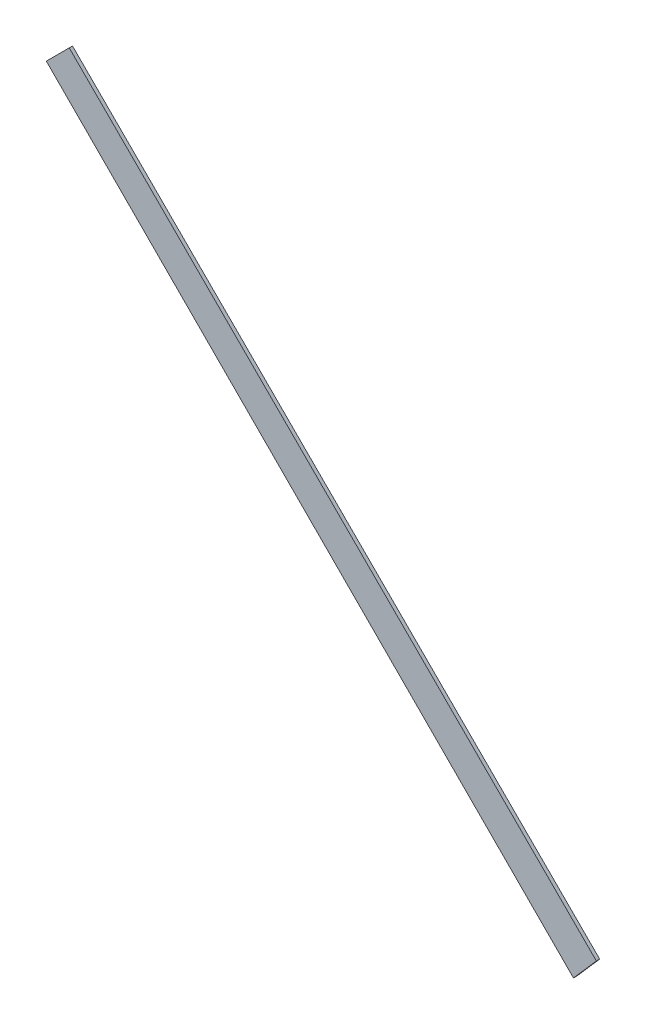
ISO-10303-21;
HEADER;
FILE_DESCRIPTION(('STEP AP214'),'2;1');
FILE_NAME('part.step','',(''),(''),'','','');
FILE_SCHEMA(('AUTOMOTIVE_DESIGN { 1 0 10303 214 1 1 1 1 }'));
ENDSEC;
DATA;
#1=APPLICATION_CONTEXT('core data for automotive mechanical design processes');
#2=APPLICATION_PROTOCOL_DEFINITION('international standard','automotive_design',2000,#1);
#3=PRODUCT_CONTEXT('',#1,'mechanical');
#4=PRODUCT('Part','Part','',(#3));
#5=PRODUCT_RELATED_PRODUCT_CATEGORY('part','',(#4));
#6=PRODUCT_DEFINITION_FORMATION('','',#4);
#7=PRODUCT_DEFINITION_CONTEXT('part definition',#1,'design');
#8=PRODUCT_DEFINITION('design','',#6,#7);
#9=PRODUCT_DEFINITION_SHAPE('','',#8);
#10=(LENGTH_UNIT() NAMED_UNIT(*) SI_UNIT(.MILLI.,.METRE.));
#11=(NAMED_UNIT(*) PLANE_ANGLE_UNIT() SI_UNIT($,.RADIAN.));
#12=(NAMED_UNIT(*) SI_UNIT($,.STERADIAN.) SOLID_ANGLE_UNIT());
#13=UNCERTAINTY_MEASURE_WITH_UNIT(LENGTH_MEASURE(1.E-05),#10,'distance_accuracy_value','');
#14=(GEOMETRIC_REPRESENTATION_CONTEXT(3) GLOBAL_UNCERTAINTY_ASSIGNED_CONTEXT((#13)) GLOBAL_UNIT_ASSIGNED_CONTEXT((#10,
#11,#12)) REPRESENTATION_CONTEXT('',''));
#15=CARTESIAN_POINT('',(0.,0.,0.));
#16=DIRECTION('',(0.,0.,1.));
#17=DIRECTION('',(1.,0.,0.));
#18=AXIS2_PLACEMENT_3D('',#15,#16,#17);
#19=CARTESIAN_POINT('',(-0.84000086,0.77499972,0.01));
#20=DIRECTION('',(0.,0.,-1.));
#21=DIRECTION('',(-1.,0.,0.));
#22=AXIS2_PLACEMENT_3D('',#19,#20,#21);
#23=PLANE('',#22);
#24=DIRECTION('',(-0.658504607868164,-0.752576694707188,0.));
#25=VECTOR('',#24,1.);
#26=CARTESIAN_POINT('',(0.770001,-0.84499958,0.01));
#27=LINE('',#26,#25);
#28=CARTESIAN_POINT('',(0.770001000000051,-0.844999579999949,0.01));
#29=VERTEX_POINT('',#28);
#30=CARTESIAN_POINT('',(0.840000859999991,-0.764999739999992,0.01));
#31=VERTEX_POINT('',#30);
#32=EDGE_CURVE('E55',#29,#31,#27,.F.);
#33=ORIENTED_EDGE('',*,*,#32,.T.);
#34=DIRECTION('',(0.707107338965828,-0.707106223406828,0.));
#35=VECTOR('',#34,1.);
#36=CARTESIAN_POINT('',(0.84000086,-0.76499974,0.01));
#37=LINE('',#36,#35);
#38=CARTESIAN_POINT('',(-0.770000999999898,0.844999580000102,0.01));
#39=VERTEX_POINT('',#38);
#40=EDGE_CURVE('E57',#31,#39,#37,.F.);
#41=ORIENTED_EDGE('',*,*,#40,.T.);
#42=DIRECTION('',(0.707106781186548,0.707106781186548,0.));
#43=VECTOR('',#42,1.);
#44=CARTESIAN_POINT('',(-0.770001,0.84499958,0.01));
#45=LINE('',#44,#43);
#46=CARTESIAN_POINT('',(-0.84000086,0.77499972,0.01));
#47=VERTEX_POINT('',#46);
#48=EDGE_CURVE('E20',#39,#47,#45,.F.);
#49=ORIENTED_EDGE('',*,*,#48,.T.);
#50=DIRECTION('',(-0.704914780736782,0.709292007496781,0.));
#51=VECTOR('',#50,1.);
#52=CARTESIAN_POINT('',(-0.84000086,0.77499972,0.01));
#53=LINE('',#52,#51);
#54=EDGE_CURVE('E80',#47,#29,#53,.F.);
#55=ORIENTED_EDGE('',*,*,#54,.T.);
#56=EDGE_LOOP('',(#33,#41,#49,#55));
#57=FACE_BOUND('',#56,.T.);
#58=ADVANCED_FACE('F17',(#57),#23,.F.);
#59=CARTESIAN_POINT('',(-0.770001,0.84499958,0.));
#60=DIRECTION('',(0.707106781186548,-0.707106781186548,0.));
#61=DIRECTION('',(0.707106781186548,0.707106781186548,0.));
#62=AXIS2_PLACEMENT_3D('',#59,#60,#61);
#63=PLANE('',#62);
#64=DIRECTION('',(0.,0.,1.));
#65=VECTOR('',#64,1.);
#66=CARTESIAN_POINT('',(-0.84000086,0.77499972,0.));
#67=LINE('',#66,#65);
#68=CARTESIAN_POINT('',(-0.84000086,0.77499972,0.));
#69=VERTEX_POINT('',#68);
#70=EDGE_CURVE('E68',#69,#47,#67,.T.);
#71=ORIENTED_EDGE('',*,*,#70,.T.);
#72=ORIENTED_EDGE('',*,*,#48,.F.);
#73=DIRECTION('',(0.,0.,1.));
#74=VECTOR('',#73,1.);
#75=CARTESIAN_POINT('',(-0.770000999999593,0.844999580000408,0.));
#76=LINE('',#75,#74);
#77=CARTESIAN_POINT('',(-0.770000999999898,0.844999580000102,0.));
#78=VERTEX_POINT('',#77);
#79=EDGE_CURVE('E63',#39,#78,#76,.F.);
#80=ORIENTED_EDGE('',*,*,#79,.T.);
#81=DIRECTION('',(0.707106781186547,0.707106781186548,0.));
#82=VECTOR('',#81,1.);
#83=CARTESIAN_POINT('',(-0.84000086,0.77499972,0.));
#84=LINE('',#83,#82);
#85=EDGE_CURVE('E83',#69,#78,#84,.T.);
#86=ORIENTED_EDGE('',*,*,#85,.F.);
#87=EDGE_LOOP('',(#71,#72,#80,#86));
#88=FACE_BOUND('',#87,.T.);
#89=ADVANCED_FACE('F65',(#88),#63,.F.);
#90=CARTESIAN_POINT('',(0.84000086,-0.76499974,0.));
#91=DIRECTION('',(-0.707106223406828,-0.707107338965828,0.));
#92=DIRECTION('',(0.707107338965828,-0.707106223406828,0.));
#93=AXIS2_PLACEMENT_3D('',#90,#91,#92);
#94=PLANE('',#93);
#95=ORIENTED_EDGE('',*,*,#79,.F.);
#96=ORIENTED_EDGE('',*,*,#40,.F.);
#97=DIRECTION('',(0.,0.,1.));
#98=VECTOR('',#97,1.);
#99=CARTESIAN_POINT('',(0.840000859999962,-0.764999739999967,0.));
#100=LINE('',#99,#98);
#101=CARTESIAN_POINT('',(0.840000859999991,-0.764999739999992,0.));
#102=VERTEX_POINT('',#101);
#103=EDGE_CURVE('E75',#31,#102,#100,.F.);
#104=ORIENTED_EDGE('',*,*,#103,.T.);
#105=DIRECTION('',(0.707107338966007,-0.707106223406649,0.));
#106=VECTOR('',#105,1.);
#107=CARTESIAN_POINT('',(-0.770001,0.84499958,0.));
#108=LINE('',#107,#106);
#109=EDGE_CURVE('E72',#78,#102,#108,.T.);
#110=ORIENTED_EDGE('',*,*,#109,.F.);
#111=EDGE_LOOP('',(#95,#96,#104,#110));
#112=FACE_BOUND('',#111,.T.);
#113=ADVANCED_FACE('F70',(#112),#94,.F.);
#114=CARTESIAN_POINT('',(0.770001,-0.84499958,0.));
#115=DIRECTION('',(-0.752576694707188,0.658504607868164,0.));
#116=DIRECTION('',(-0.658504607868164,-0.752576694707188,0.));
#117=AXIS2_PLACEMENT_3D('',#114,#115,#116);
#118=PLANE('',#117);
#119=ORIENTED_EDGE('',*,*,#103,.F.);
#120=ORIENTED_EDGE('',*,*,#32,.F.);
#121=DIRECTION('',(0.,0.,1.));
#122=VECTOR('',#121,1.);
#123=CARTESIAN_POINT('',(0.770001000000205,-0.844999579999796,0.));
#124=LINE('',#123,#122);
#125=CARTESIAN_POINT('',(0.770001000000051,-0.844999579999949,0.));
#126=VERTEX_POINT('',#125);
#127=EDGE_CURVE('E35',#29,#126,#124,.F.);
#128=ORIENTED_EDGE('',*,*,#127,.T.);
#129=DIRECTION('',(-0.658504607868518,-0.752576694706878,0.));
#130=VECTOR('',#129,1.);
#131=CARTESIAN_POINT('',(0.84000086,-0.76499974,0.));
#132=LINE('',#131,#130);
#133=EDGE_CURVE('E26',#102,#126,#132,.T.);
#134=ORIENTED_EDGE('',*,*,#133,.F.);
#135=EDGE_LOOP('',(#119,#120,#128,#134));
#136=FACE_BOUND('',#135,.T.);
#137=ADVANCED_FACE('F89',(#136),#118,.F.);
#138=CARTESIAN_POINT('',(-0.84000086,0.77499972,0.));
#139=DIRECTION('',(0.709292007496781,0.704914780736782,0.));
#140=DIRECTION('',(-0.704914780736782,0.709292007496781,0.));
#141=AXIS2_PLACEMENT_3D('',#138,#139,#140);
#142=PLANE('',#141);
#143=ORIENTED_EDGE('',*,*,#127,.F.);
#144=ORIENTED_EDGE('',*,*,#54,.F.);
#145=ORIENTED_EDGE('',*,*,#70,.F.);
#146=DIRECTION('',(-0.704914780736693,0.70929200749687,0.));
#147=VECTOR('',#146,1.);
#148=CARTESIAN_POINT('',(0.770001,-0.84499958,0.));
#149=LINE('',#148,#147);
#150=EDGE_CURVE('E11',#126,#69,#149,.T.);
#151=ORIENTED_EDGE('',*,*,#150,.F.);
#152=EDGE_LOOP('',(#143,#144,#145,#151));
#153=FACE_BOUND('',#152,.T.);
#154=ADVANCED_FACE('F91',(#153),#142,.F.);
#155=CARTESIAN_POINT('',(-0.84000086,0.77499972,0.));
#156=DIRECTION('',(0.,0.,-1.));
#157=DIRECTION('',(-1.,0.,0.));
#158=AXIS2_PLACEMENT_3D('',#155,#156,#157);
#159=PLANE('',#158);
#160=ORIENTED_EDGE('',*,*,#133,.T.);
#161=ORIENTED_EDGE('',*,*,#150,.T.);
#162=ORIENTED_EDGE('',*,*,#85,.T.);
#163=ORIENTED_EDGE('',*,*,#109,.T.);
#164=EDGE_LOOP('',(#160,#161,#162,#163));
#165=FACE_BOUND('',#164,.T.);
#166=ADVANCED_FACE('F88',(#165),#159,.T.);
#167=CLOSED_SHELL('',(#58,#89,#113,#137,#154,#166));
#168=MANIFOLD_SOLID_BREP('B1',#167);
#169=ADVANCED_BREP_SHAPE_REPRESENTATION('',(#18,#168),#14);
#170=SHAPE_DEFINITION_REPRESENTATION(#9,#169);
ENDSEC;
END-ISO-10303-21;
